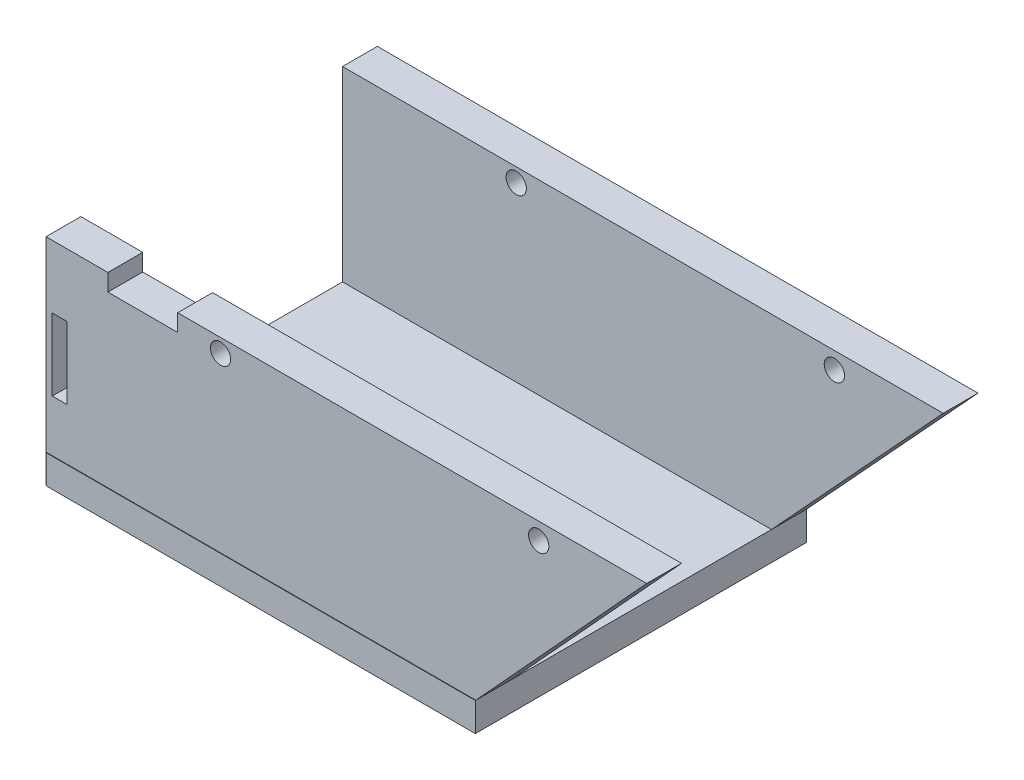
ISO-10303-21;
HEADER;
FILE_DESCRIPTION(('STEP AP214'),'2;1');
FILE_NAME('part.step','',(''),(''),'','','');
FILE_SCHEMA(('AUTOMOTIVE_DESIGN { 1 0 10303 214 1 1 1 1 }'));
ENDSEC;
DATA;
#1=APPLICATION_CONTEXT('core data for automotive mechanical design processes');
#2=APPLICATION_PROTOCOL_DEFINITION('international standard','automotive_design',2000,#1);
#3=PRODUCT_CONTEXT('',#1,'mechanical');
#4=PRODUCT('Part','Part','',(#3));
#5=PRODUCT_RELATED_PRODUCT_CATEGORY('part','',(#4));
#6=PRODUCT_DEFINITION_FORMATION('','',#4);
#7=PRODUCT_DEFINITION_CONTEXT('part definition',#1,'design');
#8=PRODUCT_DEFINITION('design','',#6,#7);
#9=PRODUCT_DEFINITION_SHAPE('','',#8);
#10=(LENGTH_UNIT() NAMED_UNIT(*) SI_UNIT(.MILLI.,.METRE.));
#11=(NAMED_UNIT(*) PLANE_ANGLE_UNIT() SI_UNIT($,.RADIAN.));
#12=(NAMED_UNIT(*) SI_UNIT($,.STERADIAN.) SOLID_ANGLE_UNIT());
#13=UNCERTAINTY_MEASURE_WITH_UNIT(LENGTH_MEASURE(1.E-05),#10,'distance_accuracy_value','');
#14=(GEOMETRIC_REPRESENTATION_CONTEXT(3) GLOBAL_UNCERTAINTY_ASSIGNED_CONTEXT((#13)) GLOBAL_UNIT_ASSIGNED_CONTEXT((#10,
#11,#12)) REPRESENTATION_CONTEXT('',''));
#15=CARTESIAN_POINT('',(0.,0.,0.));
#16=DIRECTION('',(0.,0.,1.));
#17=DIRECTION('',(1.,0.,0.));
#18=AXIS2_PLACEMENT_3D('',#15,#16,#17);
#19=CARTESIAN_POINT('',(0.,4.,0.));
#20=DIRECTION('',(0.,-1.,0.));
#21=DIRECTION('',(0.,0.,-1.));
#22=AXIS2_PLACEMENT_3D('',#19,#20,#21);
#23=PLANE('',#22);
#24=DIRECTION('',(1.,0.,0.));
#25=VECTOR('',#24,1.);
#26=CARTESIAN_POINT('',(0.,4.,0.));
#27=LINE('',#26,#25);
#28=CARTESIAN_POINT('',(0.,4.,0.));
#29=VERTEX_POINT('',#28);
#30=CARTESIAN_POINT('',(59.7906623879574,4.,0.));
#31=VERTEX_POINT('',#30);
#32=EDGE_CURVE('E294',#29,#31,#27,.T.);
#33=ORIENTED_EDGE('',*,*,#32,.T.);
#34=DIRECTION('',(0.,0.,-1.));
#35=VECTOR('',#34,1.);
#36=CARTESIAN_POINT('',(59.7906623879574,4.,0.861356651421077));
#37=LINE('',#36,#35);
#38=CARTESIAN_POINT('',(59.7906623879574,4.,-0.0663746460933395));
#39=VERTEX_POINT('',#38);
#40=EDGE_CURVE('E223',#31,#39,#37,.T.);
#41=ORIENTED_EDGE('',*,*,#40,.T.);
#42=DIRECTION('',(1.,0.,0.));
#43=VECTOR('',#42,1.);
#44=CARTESIAN_POINT('',(0.,4.,-0.0663746460933395));
#45=LINE('',#44,#43);
#46=CARTESIAN_POINT('',(0.,4.,-0.0663746460933395));
#47=VERTEX_POINT('',#46);
#48=EDGE_CURVE('E258',#47,#39,#45,.T.);
#49=ORIENTED_EDGE('',*,*,#48,.F.);
#50=DIRECTION('',(0.,0.,1.));
#51=VECTOR('',#50,1.);
#52=CARTESIAN_POINT('',(0.,4.,0.));
#53=LINE('',#52,#51);
#54=EDGE_CURVE('E295',#47,#29,#53,.T.);
#55=ORIENTED_EDGE('',*,*,#54,.T.);
#56=EDGE_LOOP('',(#33,#41,#49,#55));
#57=FACE_BOUND('',#56,.T.);
#58=ADVANCED_FACE('F39',(#57),#23,.F.);
#59=CARTESIAN_POINT('',(0.,30.,0.));
#60=DIRECTION('',(0.,1.,0.));
#61=DIRECTION('',(0.,0.,1.));
#62=AXIS2_PLACEMENT_3D('',#59,#60,#61);
#63=PLANE('',#62);
#64=DIRECTION('',(1.,0.,0.));
#65=VECTOR('',#64,1.);
#66=CARTESIAN_POINT('',(-0.121197212058664,30.,-0.0663746460933395));
#67=LINE('',#66,#65);
#68=CARTESIAN_POINT('',(-0.121197212058664,30.,-0.0663746460933395));
#69=VERTEX_POINT('',#68);
#70=CARTESIAN_POINT('',(8.50407502134942,30.,-0.0663746460933395));
#71=VERTEX_POINT('',#70);
#72=EDGE_CURVE('E494',#69,#71,#67,.T.);
#73=ORIENTED_EDGE('',*,*,#72,.T.);
#74=DIRECTION('',(0.,0.,-1.));
#75=VECTOR('',#74,1.);
#76=CARTESIAN_POINT('',(8.50407502134942,30.,0.));
#77=LINE('',#76,#75);
#78=CARTESIAN_POINT('',(8.50407502134942,30.,-4.92581520856804));
#79=VERTEX_POINT('',#78);
#80=EDGE_CURVE('E317',#71,#79,#77,.T.);
#81=ORIENTED_EDGE('',*,*,#80,.T.);
#82=DIRECTION('',(-1.,0.,0.));
#83=VECTOR('',#82,1.);
#84=CARTESIAN_POINT('',(-0.121197212058665,30.,-4.92581520856804));
#85=LINE('',#84,#83);
#86=CARTESIAN_POINT('',(-0.121197212058665,30.,-4.92581520856804));
#87=VERTEX_POINT('',#86);
#88=EDGE_CURVE('E502',#79,#87,#85,.T.);
#89=ORIENTED_EDGE('',*,*,#88,.T.);
#90=DIRECTION('',(0.,0.,1.));
#91=VECTOR('',#90,1.);
#92=CARTESIAN_POINT('',(-0.121197212058665,30.,-4.92581520856804));
#93=LINE('',#92,#91);
#94=EDGE_CURVE('E488',#87,#69,#93,.T.);
#95=ORIENTED_EDGE('',*,*,#94,.T.);
#96=EDGE_LOOP('',(#73,#81,#89,#95));
#97=FACE_BOUND('',#96,.T.);
#98=ADVANCED_FACE('F566',(#97),#63,.T.);
#99=CARTESIAN_POINT('',(0.,0.,0.));
#100=DIRECTION('',(0.,-1.,0.));
#101=DIRECTION('',(0.,0.,-1.));
#102=AXIS2_PLACEMENT_3D('',#99,#100,#101);
#103=PLANE('',#102);
#104=DIRECTION('',(0.,0.,-1.));
#105=VECTOR('',#104,1.);
#106=CARTESIAN_POINT('',(59.7906623879574,0.,0.861356651421077));
#107=LINE('',#106,#105);
#108=CARTESIAN_POINT('',(59.7906623879574,0.,0.));
#109=VERTEX_POINT('',#108);
#110=CARTESIAN_POINT('',(59.7906623879574,0.,-46.1386433485789));
#111=VERTEX_POINT('',#110);
#112=EDGE_CURVE('E246',#109,#111,#107,.T.);
#113=ORIENTED_EDGE('',*,*,#112,.F.);
#114=DIRECTION('',(1.,0.,0.));
#115=VECTOR('',#114,1.);
#116=CARTESIAN_POINT('',(0.,0.,0.));
#117=LINE('',#116,#115);
#118=CARTESIAN_POINT('',(0.,0.,0.));
#119=VERTEX_POINT('',#118);
#120=EDGE_CURVE('E303',#119,#109,#117,.T.);
#121=ORIENTED_EDGE('',*,*,#120,.F.);
#122=DIRECTION('',(0.,0.,1.));
#123=VECTOR('',#122,1.);
#124=CARTESIAN_POINT('',(0.,0.,0.));
#125=LINE('',#124,#123);
#126=CARTESIAN_POINT('',(0.,0.,-0.0663746460933395));
#127=VERTEX_POINT('',#126);
#128=EDGE_CURVE('E291',#127,#119,#125,.T.);
#129=ORIENTED_EDGE('',*,*,#128,.F.);
#130=DIRECTION('',(1.,0.,0.));
#131=VECTOR('',#130,1.);
#132=CARTESIAN_POINT('',(-0.121197212058664,0.,-0.0663746460933395));
#133=LINE('',#132,#131);
#134=CARTESIAN_POINT('',(-0.121197212058664,0.,-0.0663746460933395));
#135=VERTEX_POINT('',#134);
#136=EDGE_CURVE('E511',#135,#127,#133,.T.);
#137=ORIENTED_EDGE('',*,*,#136,.F.);
#138=DIRECTION('',(0.,0.,1.));
#139=VECTOR('',#138,1.);
#140=CARTESIAN_POINT('',(-0.121197212058665,0.,-4.92581520856804));
#141=LINE('',#140,#139);
#142=CARTESIAN_POINT('',(-0.121197212058665,0.,-4.92581520856804));
#143=VERTEX_POINT('',#142);
#144=EDGE_CURVE('E487',#143,#135,#141,.T.);
#145=ORIENTED_EDGE('',*,*,#144,.F.);
#146=DIRECTION('',(-1.,0.,0.));
#147=VECTOR('',#146,1.);
#148=CARTESIAN_POINT('',(-0.121197212058665,0.,-4.92581520856804));
#149=LINE('',#148,#147);
#150=CARTESIAN_POINT('',(0.,0.,-4.92581520856804));
#151=VERTEX_POINT('',#150);
#152=EDGE_CURVE('E493',#151,#143,#149,.T.);
#153=ORIENTED_EDGE('',*,*,#152,.F.);
#154=CARTESIAN_POINT('',(0.,0.,-46.1386433485789));
#155=VERTEX_POINT('',#154);
#156=EDGE_CURVE('E300',#155,#151,#125,.T.);
#157=ORIENTED_EDGE('',*,*,#156,.F.);
#158=DIRECTION('',(-1.,0.,0.));
#159=VECTOR('',#158,1.);
#160=CARTESIAN_POINT('',(0.,0.,-46.1386433485789));
#161=LINE('',#160,#159);
#162=EDGE_CURVE('E307',#111,#155,#161,.T.);
#163=ORIENTED_EDGE('',*,*,#162,.F.);
#164=EDGE_LOOP('',(#113,#121,#129,#137,#145,#153,#157,#163));
#165=FACE_BOUND('',#164,.T.);
#166=DIRECTION('',(0.,0.,-1.));
#167=VECTOR('',#166,1.);
#168=CARTESIAN_POINT('',(28.6391922760458,0.,-9.09575564875809));
#169=LINE('',#168,#167);
#170=CARTESIAN_POINT('',(28.6391922760458,0.,-9.09575564875809));
#171=VERTEX_POINT('',#170);
#172=CARTESIAN_POINT('',(28.6391922760458,0.,-19.493950499708));
#173=VERTEX_POINT('',#172);
#174=EDGE_CURVE('E434',#171,#173,#169,.T.);
#175=ORIENTED_EDGE('',*,*,#174,.T.);
#176=DIRECTION('',(-1.,0.,0.));
#177=VECTOR('',#176,1.);
#178=CARTESIAN_POINT('',(28.6391922760458,0.,-19.493950499708));
#179=LINE('',#178,#177);
#180=CARTESIAN_POINT('',(17.587706096208,0.,-19.493950499708));
#181=VERTEX_POINT('',#180);
#182=EDGE_CURVE('E429',#173,#181,#179,.T.);
#183=ORIENTED_EDGE('',*,*,#182,.T.);
#184=DIRECTION('',(0.,0.,-1.));
#185=VECTOR('',#184,1.);
#186=CARTESIAN_POINT('',(17.587706096208,0.,-9.09575564875809));
#187=LINE('',#186,#185);
#188=CARTESIAN_POINT('',(17.587706096208,0.,-9.09575564875809));
#189=VERTEX_POINT('',#188);
#190=EDGE_CURVE('E449',#189,#181,#187,.T.);
#191=ORIENTED_EDGE('',*,*,#190,.F.);
#192=DIRECTION('',(-1.,0.,0.));
#193=VECTOR('',#192,1.);
#194=CARTESIAN_POINT('',(28.6391922760458,0.,-9.09575564875809));
#195=LINE('',#194,#193);
#196=EDGE_CURVE('E453',#171,#189,#195,.T.);
#197=ORIENTED_EDGE('',*,*,#196,.F.);
#198=EDGE_LOOP('',(#175,#183,#191,#197));
#199=FACE_BOUND('',#198,.T.);
#200=ADVANCED_FACE('F532',(#165,#199),#103,.T.);
#201=DIRECTION('',(-1.,0.,0.));
#202=VECTOR('',#201,1.);
#203=CARTESIAN_POINT('',(0.,4.,-4.92581520856804));
#204=LINE('',#203,#202);
#205=CARTESIAN_POINT('',(59.7906623879574,4.,-4.92581520856804));
#206=VERTEX_POINT('',#205);
#207=CARTESIAN_POINT('',(0.,4.,-4.92581520856804));
#208=VERTEX_POINT('',#207);
#209=EDGE_CURVE('E231',#206,#208,#204,.T.);
#210=ORIENTED_EDGE('',*,*,#209,.F.);
#211=CARTESIAN_POINT('',(59.7906623879574,4.,-41.2792027861042));
#212=VERTEX_POINT('',#211);
#213=EDGE_CURVE('E224',#206,#212,#37,.T.);
#214=ORIENTED_EDGE('',*,*,#213,.T.);
#215=DIRECTION('',(1.,0.,0.));
#216=VECTOR('',#215,1.);
#217=CARTESIAN_POINT('',(0.,4.,-41.2792027861042));
#218=LINE('',#217,#216);
#219=CARTESIAN_POINT('',(0.,4.,-41.2792027861042));
#220=VERTEX_POINT('',#219);
#221=EDGE_CURVE('E287',#220,#212,#218,.T.);
#222=ORIENTED_EDGE('',*,*,#221,.F.);
#223=EDGE_CURVE('E250',#220,#208,#53,.T.);
#224=ORIENTED_EDGE('',*,*,#223,.T.);
#225=EDGE_LOOP('',(#210,#214,#222,#224));
#226=FACE_BOUND('',#225,.T.);
#227=ADVANCED_FACE('F248',(#226),#23,.F.);
#228=CARTESIAN_POINT('',(0.,4.,0.));
#229=DIRECTION('',(1.,0.,0.));
#230=DIRECTION('',(0.,0.,-1.));
#231=AXIS2_PLACEMENT_3D('',#228,#229,#230);
#232=PLANE('',#231);
#233=DIRECTION('',(0.,1.,0.));
#234=VECTOR('',#233,1.);
#235=CARTESIAN_POINT('',(0.,4.,-0.0663746460933395));
#236=LINE('',#235,#234);
#237=EDGE_CURVE('E252',#127,#47,#236,.T.);
#238=ORIENTED_EDGE('',*,*,#237,.F.);
#239=ORIENTED_EDGE('',*,*,#128,.T.);
#240=DIRECTION('',(0.,-1.,0.));
#241=VECTOR('',#240,1.);
#242=CARTESIAN_POINT('',(0.,4.,0.));
#243=LINE('',#242,#241);
#244=EDGE_CURVE('E313',#29,#119,#243,.T.);
#245=ORIENTED_EDGE('',*,*,#244,.F.);
#246=ORIENTED_EDGE('',*,*,#54,.F.);
#247=EDGE_LOOP('',(#238,#239,#245,#246));
#248=FACE_BOUND('',#247,.T.);
#249=ADVANCED_FACE('F41',(#248),#232,.F.);
#250=DIRECTION('',(0.,-1.,0.));
#251=VECTOR('',#250,1.);
#252=CARTESIAN_POINT('',(0.,4.,-4.92581520856804));
#253=LINE('',#252,#251);
#254=EDGE_CURVE('E253',#208,#151,#253,.T.);
#255=ORIENTED_EDGE('',*,*,#254,.F.);
#256=ORIENTED_EDGE('',*,*,#223,.F.);
#257=DIRECTION('',(0.,-1.,0.));
#258=VECTOR('',#257,1.);
#259=CARTESIAN_POINT('',(0.,30.,-41.2792027861042));
#260=LINE('',#259,#258);
#261=CARTESIAN_POINT('',(0.,30.,-41.2792027861042));
#262=VERTEX_POINT('',#261);
#263=EDGE_CURVE('E283',#262,#220,#260,.T.);
#264=ORIENTED_EDGE('',*,*,#263,.F.);
#265=DIRECTION('',(0.,0.,1.));
#266=VECTOR('',#265,1.);
#267=CARTESIAN_POINT('',(0.,30.,-46.1386433485789));
#268=LINE('',#267,#266);
#269=CARTESIAN_POINT('',(0.,30.,-46.1386433485789));
#270=VERTEX_POINT('',#269);
#271=EDGE_CURVE('E267',#270,#262,#268,.T.);
#272=ORIENTED_EDGE('',*,*,#271,.F.);
#273=DIRECTION('',(0.,-1.,0.));
#274=VECTOR('',#273,1.);
#275=CARTESIAN_POINT('',(0.,4.,-46.1386433485789));
#276=LINE('',#275,#274);
#277=EDGE_CURVE('E299',#270,#155,#276,.T.);
#278=ORIENTED_EDGE('',*,*,#277,.T.);
#279=ORIENTED_EDGE('',*,*,#156,.T.);
#280=EDGE_LOOP('',(#255,#256,#264,#272,#278,#279));
#281=FACE_BOUND('',#280,.T.);
#282=ADVANCED_FACE('F581',(#281),#232,.F.);
#283=CARTESIAN_POINT('',(0.,4.,0.));
#284=DIRECTION('',(0.,0.,-1.));
#285=DIRECTION('',(-1.,0.,0.));
#286=AXIS2_PLACEMENT_3D('',#283,#284,#285);
#287=PLANE('',#286);
#288=ORIENTED_EDGE('',*,*,#120,.T.);
#289=DIRECTION('',(0.,1.,0.));
#290=VECTOR('',#289,1.);
#291=CARTESIAN_POINT('',(59.7906623879574,4.,0.));
#292=LINE('',#291,#290);
#293=EDGE_CURVE('E377',#109,#31,#292,.T.);
#294=ORIENTED_EDGE('',*,*,#293,.T.);
#295=ORIENTED_EDGE('',*,*,#32,.F.);
#296=ORIENTED_EDGE('',*,*,#244,.T.);
#297=EDGE_LOOP('',(#288,#294,#295,#296));
#298=FACE_BOUND('',#297,.T.);
#299=ADVANCED_FACE('F588',(#298),#287,.F.);
#300=CARTESIAN_POINT('',(0.,4.,-46.1386433485789));
#301=DIRECTION('',(0.,0.,1.));
#302=DIRECTION('',(1.,0.,0.));
#303=AXIS2_PLACEMENT_3D('',#300,#301,#302);
#304=PLANE('',#303);
#305=CARTESIAN_POINT('',(68.5585511504954,27.6457680795579,-46.1386433485789));
#306=DIRECTION('',(0.,0.,1.));
#307=DIRECTION('',(1.,0.,0.));
#308=AXIS2_PLACEMENT_3D('',#305,#306,#307);
#309=CIRCLE('',#308,1.41452911502597);
#310=CARTESIAN_POINT('',(69.9730802655213,27.6457680795579,-46.1386433485789));
#311=VERTEX_POINT('',#310);
#312=EDGE_CURVE('E237',#311,#311,#309,.T.);
#313=ORIENTED_EDGE('',*,*,#312,.T.);
#314=EDGE_LOOP('',(#313));
#315=FACE_BOUND('',#314,.T.);
#316=CARTESIAN_POINT('',(24.2084878524862,28.0642925065622,-46.1386433485789));
#317=DIRECTION('',(0.,0.,1.));
#318=DIRECTION('',(1.,0.,0.));
#319=AXIS2_PLACEMENT_3D('',#316,#317,#318);
#320=CIRCLE('',#319,1.41452911502597);
#321=CARTESIAN_POINT('',(25.6230169675122,28.0642925065622,-46.1386433485789));
#322=VERTEX_POINT('',#321);
#323=EDGE_CURVE('E347',#322,#322,#320,.T.);
#324=ORIENTED_EDGE('',*,*,#323,.T.);
#325=EDGE_LOOP('',(#324));
#326=FACE_BOUND('',#325,.T.);
#327=DIRECTION('',(-0.677245321986034,-0.735757279167548,0.));
#328=VECTOR('',#327,1.);
#329=CARTESIAN_POINT('',(32.3670038646585,-25.7929800692494,-46.1386433485789));
#330=LINE('',#329,#328);
#331=CARTESIAN_POINT('',(83.7229820132004,30.,-46.1386433485789));
#332=VERTEX_POINT('',#331);
#333=CARTESIAN_POINT('',(59.7906623879574,4.,-46.1386433485789));
#334=VERTEX_POINT('',#333);
#335=EDGE_CURVE('E477',#332,#334,#330,.T.);
#336=ORIENTED_EDGE('',*,*,#335,.T.);
#337=DIRECTION('',(0.,1.,0.));
#338=VECTOR('',#337,1.);
#339=CARTESIAN_POINT('',(59.7906623879574,0.,-46.1386433485789));
#340=LINE('',#339,#338);
#341=EDGE_CURVE('E372',#111,#334,#340,.T.);
#342=ORIENTED_EDGE('',*,*,#341,.F.);
#343=ORIENTED_EDGE('',*,*,#162,.T.);
#344=ORIENTED_EDGE('',*,*,#277,.F.);
#345=DIRECTION('',(-1.,0.,0.));
#346=VECTOR('',#345,1.);
#347=CARTESIAN_POINT('',(0.,30.,-46.1386433485789));
#348=LINE('',#347,#346);
#349=EDGE_CURVE('E279',#332,#270,#348,.T.);
#350=ORIENTED_EDGE('',*,*,#349,.F.);
#351=EDGE_LOOP('',(#336,#342,#343,#344,#350));
#352=FACE_BOUND('',#351,.T.);
#353=ADVANCED_FACE('F585',(#315,#326,#352),#304,.F.);
#354=CARTESIAN_POINT('',(0.,30.,-41.2792027861042));
#355=DIRECTION('',(0.,0.,-1.));
#356=DIRECTION('',(-1.,0.,0.));
#357=AXIS2_PLACEMENT_3D('',#354,#355,#356);
#358=PLANE('',#357);
#359=CARTESIAN_POINT('',(68.5585511504954,27.6457680795579,-41.2792027861042));
#360=DIRECTION('',(0.,0.,-1.));
#361=DIRECTION('',(-1.,0.,0.));
#362=AXIS2_PLACEMENT_3D('',#359,#360,#361);
#363=CIRCLE('',#362,1.41452911502597);
#364=CARTESIAN_POINT('',(67.1440220354694,27.6457680795579,-41.2792027861042));
#365=VERTEX_POINT('',#364);
#366=EDGE_CURVE('E361',#365,#365,#363,.T.);
#367=ORIENTED_EDGE('',*,*,#366,.T.);
#368=EDGE_LOOP('',(#367));
#369=FACE_BOUND('',#368,.T.);
#370=CARTESIAN_POINT('',(24.2084878524862,28.0642925065622,-41.2792027861042));
#371=DIRECTION('',(0.,0.,-1.));
#372=DIRECTION('',(-1.,0.,0.));
#373=AXIS2_PLACEMENT_3D('',#370,#371,#372);
#374=CIRCLE('',#373,1.41452911502597);
#375=CARTESIAN_POINT('',(22.7939587374602,28.0642925065622,-41.2792027861042));
#376=VERTEX_POINT('',#375);
#377=EDGE_CURVE('E340',#376,#376,#374,.T.);
#378=ORIENTED_EDGE('',*,*,#377,.T.);
#379=EDGE_LOOP('',(#378));
#380=FACE_BOUND('',#379,.T.);
#381=ORIENTED_EDGE('',*,*,#221,.T.);
#382=DIRECTION('',(-0.677245321986034,-0.735757279167548,0.));
#383=VECTOR('',#382,1.);
#384=CARTESIAN_POINT('',(83.7229820132004,30.,-41.2792027861042));
#385=LINE('',#384,#383);
#386=CARTESIAN_POINT('',(83.7229820132004,30.,-41.2792027861042));
#387=VERTEX_POINT('',#386);
#388=EDGE_CURVE('E472',#387,#212,#385,.T.);
#389=ORIENTED_EDGE('',*,*,#388,.F.);
#390=DIRECTION('',(1.,0.,0.));
#391=VECTOR('',#390,1.);
#392=CARTESIAN_POINT('',(0.,30.,-41.2792027861042));
#393=LINE('',#392,#391);
#394=EDGE_CURVE('E271',#262,#387,#393,.T.);
#395=ORIENTED_EDGE('',*,*,#394,.F.);
#396=ORIENTED_EDGE('',*,*,#263,.T.);
#397=EDGE_LOOP('',(#381,#389,#395,#396));
#398=FACE_BOUND('',#397,.T.);
#399=ADVANCED_FACE('F587',(#369,#380,#398),#358,.F.);
#400=CARTESIAN_POINT('',(0.,30.,0.));
#401=DIRECTION('',(0.,1.,0.));
#402=DIRECTION('',(0.,0.,1.));
#403=AXIS2_PLACEMENT_3D('',#400,#401,#402);
#404=PLANE('',#403);
#405=ORIENTED_EDGE('',*,*,#271,.T.);
#406=ORIENTED_EDGE('',*,*,#394,.T.);
#407=DIRECTION('',(0.,0.,-1.));
#408=VECTOR('',#407,1.);
#409=CARTESIAN_POINT('',(83.7229820132004,30.,-46.1386433485789));
#410=LINE('',#409,#408);
#411=EDGE_CURVE('E275',#387,#332,#410,.T.);
#412=ORIENTED_EDGE('',*,*,#411,.T.);
#413=ORIENTED_EDGE('',*,*,#349,.T.);
#414=EDGE_LOOP('',(#405,#406,#412,#413));
#415=FACE_BOUND('',#414,.T.);
#416=ADVANCED_FACE('F603',(#415),#404,.T.);
#417=CARTESIAN_POINT('',(-0.121197212058664,30.,-0.0663746460933395));
#418=DIRECTION('',(0.,0.,-1.));
#419=DIRECTION('',(-1.,0.,0.));
#420=AXIS2_PLACEMENT_3D('',#417,#418,#419);
#421=PLANE('',#420);
#422=CARTESIAN_POINT('',(68.5585511504954,27.6457680795579,-0.0663746460933395));
#423=DIRECTION('',(0.,0.,1.));
#424=DIRECTION('',(1.,0.,0.));
#425=AXIS2_PLACEMENT_3D('',#422,#423,#424);
#426=CIRCLE('',#425,1.41452911502597);
#427=CARTESIAN_POINT('',(69.9730802655213,27.6457680795579,-0.0663746460933395));
#428=VERTEX_POINT('',#427);
#429=EDGE_CURVE('E341',#428,#428,#426,.T.);
#430=ORIENTED_EDGE('',*,*,#429,.F.);
#431=EDGE_LOOP('',(#430));
#432=FACE_BOUND('',#431,.T.);
#433=CARTESIAN_POINT('',(24.2084878524862,28.0642925065622,-0.0663746460933395));
#434=DIRECTION('',(0.,0.,1.));
#435=DIRECTION('',(1.,0.,0.));
#436=AXIS2_PLACEMENT_3D('',#433,#434,#435);
#437=CIRCLE('',#436,1.41452911502597);
#438=CARTESIAN_POINT('',(25.6230169675122,28.0642925065622,-0.0663746460933395));
#439=VERTEX_POINT('',#438);
#440=EDGE_CURVE('E350',#439,#439,#437,.T.);
#441=ORIENTED_EDGE('',*,*,#440,.F.);
#442=EDGE_LOOP('',(#441));
#443=FACE_BOUND('',#442,.T.);
#444=DIRECTION('',(-1.,0.,0.));
#445=VECTOR('',#444,1.);
#446=CARTESIAN_POINT('',(2.81627950396057,21.2324838019526,-0.0663746460933395));
#447=LINE('',#446,#445);
#448=CARTESIAN_POINT('',(2.81627950396057,21.2324838019526,-0.0663746460933395));
#449=VERTEX_POINT('',#448);
#450=CARTESIAN_POINT('',(0.747328793565316,21.2324838019526,-0.0663746460933395));
#451=VERTEX_POINT('',#450);
#452=EDGE_CURVE('E383',#449,#451,#447,.T.);
#453=ORIENTED_EDGE('',*,*,#452,.F.);
#454=DIRECTION('',(0.,1.,0.));
#455=VECTOR('',#454,1.);
#456=CARTESIAN_POINT('',(2.81627950396057,11.1989252465889,-0.0663746460933395));
#457=LINE('',#456,#455);
#458=CARTESIAN_POINT('',(2.81627950396057,11.1989252465889,-0.0663746460933395));
#459=VERTEX_POINT('',#458);
#460=EDGE_CURVE('E57',#459,#449,#457,.T.);
#461=ORIENTED_EDGE('',*,*,#460,.F.);
#462=DIRECTION('',(1.,0.,0.));
#463=VECTOR('',#462,1.);
#464=CARTESIAN_POINT('',(2.81627950396057,11.1989252465889,-0.0663746460933395));
#465=LINE('',#464,#463);
#466=CARTESIAN_POINT('',(0.747328793565316,11.1989252465889,-0.0663746460933395));
#467=VERTEX_POINT('',#466);
#468=EDGE_CURVE('E390',#467,#459,#465,.T.);
#469=ORIENTED_EDGE('',*,*,#468,.F.);
#470=DIRECTION('',(0.,-1.,0.));
#471=VECTOR('',#470,1.);
#472=CARTESIAN_POINT('',(0.747328793565316,11.1989252465889,-0.0663746460933395));
#473=LINE('',#472,#471);
#474=EDGE_CURVE('E386',#451,#467,#473,.T.);
#475=ORIENTED_EDGE('',*,*,#474,.F.);
#476=EDGE_LOOP('',(#453,#461,#469,#475));
#477=FACE_BOUND('',#476,.T.);
#478=ORIENTED_EDGE('',*,*,#48,.T.);
#479=DIRECTION('',(0.675474610907501,0.737383245008564,0.));
#480=VECTOR('',#479,1.);
#481=CARTESIAN_POINT('',(45.405096025758,-11.7040330371459,-0.0663746460933395));
#482=LINE('',#481,#480);
#483=CARTESIAN_POINT('',(83.4781501526332,29.8584946228411,-0.0663746460933395));
#484=VERTEX_POINT('',#483);
#485=EDGE_CURVE('E218',#39,#484,#482,.T.);
#486=ORIENTED_EDGE('',*,*,#485,.T.);
#487=DIRECTION('',(-0.657954189143697,-0.753057955929197,0.));
#488=VECTOR('',#487,1.);
#489=CARTESIAN_POINT('',(60.8853274779761,4.,-0.0663746460933395));
#490=LINE('',#489,#488);
#491=CARTESIAN_POINT('',(83.601784801142,30.,-0.0663746460933395));
#492=VERTEX_POINT('',#491);
#493=EDGE_CURVE('E481',#492,#484,#490,.T.);
#494=ORIENTED_EDGE('',*,*,#493,.F.);
#495=CARTESIAN_POINT('',(18.2355792677811,30.,-0.0663746460933395));
#496=VERTEX_POINT('',#495);
#497=EDGE_CURVE('E492',#496,#492,#67,.T.);
#498=ORIENTED_EDGE('',*,*,#497,.F.);
#499=DIRECTION('',(0.,1.,0.));
#500=VECTOR('',#499,1.);
#501=CARTESIAN_POINT('',(18.2355792677811,27.6228751395848,-0.0663746460933395));
#502=LINE('',#501,#500);
#503=CARTESIAN_POINT('',(18.2355792677811,27.6228751395848,-0.0663746460933395));
#504=VERTEX_POINT('',#503);
#505=EDGE_CURVE('E413',#504,#496,#502,.T.);
#506=ORIENTED_EDGE('',*,*,#505,.F.);
#507=DIRECTION('',(-1.,0.,0.));
#508=VECTOR('',#507,1.);
#509=CARTESIAN_POINT('',(18.2355792677811,27.6228751395848,-0.0663746460933395));
#510=LINE('',#509,#508);
#511=CARTESIAN_POINT('',(8.50407502134942,27.6228751395848,-0.0663746460933395));
#512=VERTEX_POINT('',#511);
#513=EDGE_CURVE('E409',#504,#512,#510,.T.);
#514=ORIENTED_EDGE('',*,*,#513,.T.);
#515=DIRECTION('',(0.,1.,0.));
#516=VECTOR('',#515,1.);
#517=CARTESIAN_POINT('',(8.50407502134942,27.6228751395848,-0.0663746460933395));
#518=LINE('',#517,#516);
#519=EDGE_CURVE('E398',#512,#71,#518,.T.);
#520=ORIENTED_EDGE('',*,*,#519,.T.);
#521=ORIENTED_EDGE('',*,*,#72,.F.);
#522=DIRECTION('',(0.,-1.,0.));
#523=VECTOR('',#522,1.);
#524=CARTESIAN_POINT('',(-0.121197212058664,30.,-0.0663746460933395));
#525=LINE('',#524,#523);
#526=EDGE_CURVE('E260',#69,#135,#525,.T.);
#527=ORIENTED_EDGE('',*,*,#526,.T.);
#528=ORIENTED_EDGE('',*,*,#136,.T.);
#529=ORIENTED_EDGE('',*,*,#237,.T.);
#530=EDGE_LOOP('',(#478,#486,#494,#498,#506,#514,#520,#521,#527,#528,#529));
#531=FACE_BOUND('',#530,.T.);
#532=ADVANCED_FACE('F523',(#432,#443,#477,#531),#421,.F.);
#533=CARTESIAN_POINT('',(-0.121197212058665,30.,-4.92581520856804));
#534=DIRECTION('',(0.,0.,1.));
#535=DIRECTION('',(1.,0.,0.));
#536=AXIS2_PLACEMENT_3D('',#533,#534,#535);
#537=PLANE('',#536);
#538=CARTESIAN_POINT('',(68.5585511504954,27.6457680795579,-4.92581520856804));
#539=DIRECTION('',(0.,0.,1.));
#540=DIRECTION('',(1.,0.,0.));
#541=AXIS2_PLACEMENT_3D('',#538,#539,#540);
#542=CIRCLE('',#541,1.41452911502597);
#543=CARTESIAN_POINT('',(69.9730802655213,27.6457680795579,-4.92581520856804));
#544=VERTEX_POINT('',#543);
#545=EDGE_CURVE('E43',#544,#544,#542,.T.);
#546=ORIENTED_EDGE('',*,*,#545,.T.);
#547=EDGE_LOOP('',(#546));
#548=FACE_BOUND('',#547,.T.);
#549=CARTESIAN_POINT('',(24.2084878524862,28.0642925065622,-4.92581520856804));
#550=DIRECTION('',(0.,0.,1.));
#551=DIRECTION('',(1.,0.,0.));
#552=AXIS2_PLACEMENT_3D('',#549,#550,#551);
#553=CIRCLE('',#552,1.41452911502597);
#554=CARTESIAN_POINT('',(25.6230169675122,28.0642925065622,-4.92581520856804));
#555=VERTEX_POINT('',#554);
#556=EDGE_CURVE('E337',#555,#555,#553,.T.);
#557=ORIENTED_EDGE('',*,*,#556,.T.);
#558=EDGE_LOOP('',(#557));
#559=FACE_BOUND('',#558,.T.);
#560=DIRECTION('',(1.,0.,0.));
#561=VECTOR('',#560,1.);
#562=CARTESIAN_POINT('',(-0.121197212058665,11.1989252465889,-4.92581520856804));
#563=LINE('',#562,#561);
#564=CARTESIAN_POINT('',(0.747328793565316,11.1989252465889,-4.92581520856804));
#565=VERTEX_POINT('',#564);
#566=CARTESIAN_POINT('',(2.81627950396057,11.1989252465889,-4.92581520856804));
#567=VERTEX_POINT('',#566);
#568=EDGE_CURVE('E49',#565,#567,#563,.T.);
#569=ORIENTED_EDGE('',*,*,#568,.T.);
#570=DIRECTION('',(0.,1.,0.));
#571=VECTOR('',#570,1.);
#572=CARTESIAN_POINT('',(2.81627950396057,30.,-4.92581520856804));
#573=LINE('',#572,#571);
#574=CARTESIAN_POINT('',(2.81627950396057,21.2324838019526,-4.92581520856804));
#575=VERTEX_POINT('',#574);
#576=EDGE_CURVE('E11',#567,#575,#573,.T.);
#577=ORIENTED_EDGE('',*,*,#576,.T.);
#578=DIRECTION('',(-1.,0.,0.));
#579=VECTOR('',#578,1.);
#580=CARTESIAN_POINT('',(-0.121197212058665,21.2324838019526,-4.92581520856804));
#581=LINE('',#580,#579);
#582=CARTESIAN_POINT('',(0.747328793565316,21.2324838019526,-4.92581520856804));
#583=VERTEX_POINT('',#582);
#584=EDGE_CURVE('E327',#575,#583,#581,.T.);
#585=ORIENTED_EDGE('',*,*,#584,.T.);
#586=DIRECTION('',(0.,-1.,0.));
#587=VECTOR('',#586,1.);
#588=CARTESIAN_POINT('',(0.747328793565316,30.,-4.92581520856804));
#589=LINE('',#588,#587);
#590=EDGE_CURVE('E331',#583,#565,#589,.T.);
#591=ORIENTED_EDGE('',*,*,#590,.T.);
#592=EDGE_LOOP('',(#569,#577,#585,#591));
#593=FACE_BOUND('',#592,.T.);
#594=DIRECTION('',(-0.657954189143697,-0.753057955929197,0.));
#595=VECTOR('',#594,1.);
#596=CARTESIAN_POINT('',(47.3577948557664,-11.4828652713722,-4.92581520856804));
#597=LINE('',#596,#595);
#598=CARTESIAN_POINT('',(83.601784801142,30.,-4.92581520856804));
#599=VERTEX_POINT('',#598);
#600=CARTESIAN_POINT('',(83.4781501526332,29.8584946228411,-4.92581520856804));
#601=VERTEX_POINT('',#600);
#602=EDGE_CURVE('E234',#599,#601,#597,.T.);
#603=ORIENTED_EDGE('',*,*,#602,.T.);
#604=DIRECTION('',(0.675474610907501,0.737383245008564,0.));
#605=VECTOR('',#604,1.);
#606=CARTESIAN_POINT('',(59.7906623879574,4.,-4.92581520856804));
#607=LINE('',#606,#605);
#608=EDGE_CURVE('E215',#206,#601,#607,.T.);
#609=ORIENTED_EDGE('',*,*,#608,.F.);
#610=ORIENTED_EDGE('',*,*,#209,.T.);
#611=ORIENTED_EDGE('',*,*,#254,.T.);
#612=ORIENTED_EDGE('',*,*,#152,.T.);
#613=DIRECTION('',(0.,-1.,0.));
#614=VECTOR('',#613,1.);
#615=CARTESIAN_POINT('',(-0.121197212058665,30.,-4.92581520856804));
#616=LINE('',#615,#614);
#617=EDGE_CURVE('E507',#87,#143,#616,.T.);
#618=ORIENTED_EDGE('',*,*,#617,.F.);
#619=ORIENTED_EDGE('',*,*,#88,.F.);
#620=DIRECTION('',(0.,1.,0.));
#621=VECTOR('',#620,1.);
#622=CARTESIAN_POINT('',(8.50407502134942,30.,-4.92581520856804));
#623=LINE('',#622,#621);
#624=CARTESIAN_POINT('',(8.50407502134942,27.6228751395848,-4.92581520856804));
#625=VERTEX_POINT('',#624);
#626=EDGE_CURVE('E420',#625,#79,#623,.T.);
#627=ORIENTED_EDGE('',*,*,#626,.F.);
#628=DIRECTION('',(-1.,0.,0.));
#629=VECTOR('',#628,1.);
#630=CARTESIAN_POINT('',(-0.121197212058665,27.6228751395848,-4.92581520856804));
#631=LINE('',#630,#629);
#632=CARTESIAN_POINT('',(18.2355792677811,27.6228751395848,-4.92581520856804));
#633=VERTEX_POINT('',#632);
#634=EDGE_CURVE('E324',#633,#625,#631,.T.);
#635=ORIENTED_EDGE('',*,*,#634,.F.);
#636=DIRECTION('',(0.,1.,0.));
#637=VECTOR('',#636,1.);
#638=CARTESIAN_POINT('',(18.2355792677811,30.,-4.92581520856804));
#639=LINE('',#638,#637);
#640=CARTESIAN_POINT('',(18.2355792677811,30.,-4.92581520856804));
#641=VERTEX_POINT('',#640);
#642=EDGE_CURVE('E425',#633,#641,#639,.T.);
#643=ORIENTED_EDGE('',*,*,#642,.T.);
#644=EDGE_CURVE('E503',#599,#641,#85,.T.);
#645=ORIENTED_EDGE('',*,*,#644,.F.);
#646=EDGE_LOOP('',(#603,#609,#610,#611,#612,#618,#619,#627,#635,#643,#645));
#647=FACE_BOUND('',#646,.T.);
#648=ADVANCED_FACE('F228',(#548,#559,#593,#647),#537,.F.);
#649=CARTESIAN_POINT('',(-0.121197212058665,30.,-4.92581520856804));
#650=DIRECTION('',(1.,0.,0.));
#651=DIRECTION('',(0.,0.,-1.));
#652=AXIS2_PLACEMENT_3D('',#649,#650,#651);
#653=PLANE('',#652);
#654=ORIENTED_EDGE('',*,*,#144,.T.);
#655=ORIENTED_EDGE('',*,*,#526,.F.);
#656=ORIENTED_EDGE('',*,*,#94,.F.);
#657=ORIENTED_EDGE('',*,*,#617,.T.);
#658=EDGE_LOOP('',(#654,#655,#656,#657));
#659=FACE_BOUND('',#658,.T.);
#660=ADVANCED_FACE('F527',(#659),#653,.F.);
#661=DIRECTION('',(0.,0.,-1.));
#662=VECTOR('',#661,1.);
#663=CARTESIAN_POINT('',(18.2355792677811,30.,0.));
#664=LINE('',#663,#662);
#665=EDGE_CURVE('E321',#496,#641,#664,.T.);
#666=ORIENTED_EDGE('',*,*,#665,.F.);
#667=ORIENTED_EDGE('',*,*,#497,.T.);
#668=DIRECTION('',(0.,0.,-1.));
#669=VECTOR('',#668,1.);
#670=CARTESIAN_POINT('',(83.601784801142,30.,-4.92581520856804));
#671=LINE('',#670,#669);
#672=EDGE_CURVE('E498',#492,#599,#671,.T.);
#673=ORIENTED_EDGE('',*,*,#672,.T.);
#674=ORIENTED_EDGE('',*,*,#644,.T.);
#675=EDGE_LOOP('',(#666,#667,#673,#674));
#676=FACE_BOUND('',#675,.T.);
#677=ADVANCED_FACE('F573',(#676),#63,.T.);
#678=CARTESIAN_POINT('',(60.8853274779761,4.,-18.0663746460933));
#679=DIRECTION('',(-0.753057955929197,0.657954189143697,0.));
#680=DIRECTION('',(-0.657954189143697,-0.753057955929197,0.));
#681=AXIS2_PLACEMENT_3D('',#678,#679,#680);
#682=PLANE('',#681);
#683=ORIENTED_EDGE('',*,*,#493,.T.);
#684=DIRECTION('',(0.,0.,-1.));
#685=VECTOR('',#684,1.);
#686=CARTESIAN_POINT('',(83.4781501526332,29.8584946228411,42.074184791432));
#687=LINE('',#686,#685);
#688=EDGE_CURVE('E236',#484,#601,#687,.T.);
#689=ORIENTED_EDGE('',*,*,#688,.T.);
#690=ORIENTED_EDGE('',*,*,#602,.F.);
#691=ORIENTED_EDGE('',*,*,#672,.F.);
#692=EDGE_LOOP('',(#683,#689,#690,#691));
#693=FACE_BOUND('',#692,.T.);
#694=ADVANCED_FACE('F618',(#693),#682,.F.);
#695=CARTESIAN_POINT('',(83.7229820132004,30.,-59.2792027861042));
#696=DIRECTION('',(-0.735757279167548,0.677245321986034,0.));
#697=DIRECTION('',(-0.677245321986034,-0.735757279167548,0.));
#698=AXIS2_PLACEMENT_3D('',#695,#696,#697);
#699=PLANE('',#698);
#700=ORIENTED_EDGE('',*,*,#411,.F.);
#701=ORIENTED_EDGE('',*,*,#388,.T.);
#702=DIRECTION('',(0.,0.,1.));
#703=VECTOR('',#702,1.);
#704=CARTESIAN_POINT('',(59.7906623879574,4.,-59.2792027861042));
#705=LINE('',#704,#703);
#706=EDGE_CURVE('E242',#334,#212,#705,.T.);
#707=ORIENTED_EDGE('',*,*,#706,.F.);
#708=ORIENTED_EDGE('',*,*,#335,.F.);
#709=EDGE_LOOP('',(#700,#701,#707,#708));
#710=FACE_BOUND('',#709,.T.);
#711=ADVANCED_FACE('F605',(#710),#699,.F.);
#712=CARTESIAN_POINT('',(28.6391922760458,1.99999999999999,-19.493950499708));
#713=DIRECTION('',(0.,0.,1.));
#714=DIRECTION('',(1.,0.,0.));
#715=AXIS2_PLACEMENT_3D('',#712,#713,#714);
#716=PLANE('',#715);
#717=ORIENTED_EDGE('',*,*,#182,.F.);
#718=DIRECTION('',(0.,-1.,0.));
#719=VECTOR('',#718,1.);
#720=CARTESIAN_POINT('',(28.6391922760458,1.99999999999999,-19.493950499708));
#721=LINE('',#720,#719);
#722=CARTESIAN_POINT('',(28.6391922760458,1.99999999999999,-19.493950499708));
#723=VERTEX_POINT('',#722);
#724=EDGE_CURVE('E445',#723,#173,#721,.T.);
#725=ORIENTED_EDGE('',*,*,#724,.F.);
#726=DIRECTION('',(-1.,0.,0.));
#727=VECTOR('',#726,1.);
#728=CARTESIAN_POINT('',(28.6391922760458,1.99999999999999,-19.493950499708));
#729=LINE('',#728,#727);
#730=CARTESIAN_POINT('',(17.587706096208,1.99999999999999,-19.493950499708));
#731=VERTEX_POINT('',#730);
#732=EDGE_CURVE('E430',#723,#731,#729,.T.);
#733=ORIENTED_EDGE('',*,*,#732,.T.);
#734=DIRECTION('',(0.,-1.,0.));
#735=VECTOR('',#734,1.);
#736=CARTESIAN_POINT('',(17.587706096208,1.99999999999999,-19.493950499708));
#737=LINE('',#736,#735);
#738=EDGE_CURVE('E469',#731,#181,#737,.T.);
#739=ORIENTED_EDGE('',*,*,#738,.T.);
#740=EDGE_LOOP('',(#717,#725,#733,#739));
#741=FACE_BOUND('',#740,.T.);
#742=ADVANCED_FACE('F625',(#741),#716,.T.);
#743=CARTESIAN_POINT('',(17.587706096208,1.99999999999999,-9.09575564875809));
#744=DIRECTION('',(-1.,0.,0.));
#745=DIRECTION('',(0.,0.,1.));
#746=AXIS2_PLACEMENT_3D('',#743,#744,#745);
#747=PLANE('',#746);
#748=ORIENTED_EDGE('',*,*,#190,.T.);
#749=ORIENTED_EDGE('',*,*,#738,.F.);
#750=DIRECTION('',(0.,0.,-1.));
#751=VECTOR('',#750,1.);
#752=CARTESIAN_POINT('',(17.587706096208,1.99999999999999,-9.09575564875809));
#753=LINE('',#752,#751);
#754=CARTESIAN_POINT('',(17.587706096208,1.99999999999999,-9.09575564875809));
#755=VERTEX_POINT('',#754);
#756=EDGE_CURVE('E433',#755,#731,#753,.T.);
#757=ORIENTED_EDGE('',*,*,#756,.F.);
#758=DIRECTION('',(0.,-1.,0.));
#759=VECTOR('',#758,1.);
#760=CARTESIAN_POINT('',(17.587706096208,1.99999999999999,-9.09575564875809));
#761=LINE('',#760,#759);
#762=EDGE_CURVE('E466',#755,#189,#761,.T.);
#763=ORIENTED_EDGE('',*,*,#762,.T.);
#764=EDGE_LOOP('',(#748,#749,#757,#763));
#765=FACE_BOUND('',#764,.T.);
#766=ADVANCED_FACE('F870',(#765),#747,.F.);
#767=CARTESIAN_POINT('',(28.6391922760458,1.99999999999999,-9.09575564875809));
#768=DIRECTION('',(0.,0.,1.));
#769=DIRECTION('',(1.,0.,0.));
#770=AXIS2_PLACEMENT_3D('',#767,#768,#769);
#771=PLANE('',#770);
#772=ORIENTED_EDGE('',*,*,#196,.T.);
#773=ORIENTED_EDGE('',*,*,#762,.F.);
#774=DIRECTION('',(-1.,0.,0.));
#775=VECTOR('',#774,1.);
#776=CARTESIAN_POINT('',(28.6391922760458,1.99999999999999,-9.09575564875809));
#777=LINE('',#776,#775);
#778=CARTESIAN_POINT('',(28.6391922760458,1.99999999999999,-9.09575564875809));
#779=VERTEX_POINT('',#778);
#780=EDGE_CURVE('E438',#779,#755,#777,.T.);
#781=ORIENTED_EDGE('',*,*,#780,.F.);
#782=DIRECTION('',(0.,-1.,0.));
#783=VECTOR('',#782,1.);
#784=CARTESIAN_POINT('',(28.6391922760458,1.99999999999999,-9.09575564875809));
#785=LINE('',#784,#783);
#786=EDGE_CURVE('E463',#779,#171,#785,.T.);
#787=ORIENTED_EDGE('',*,*,#786,.T.);
#788=EDGE_LOOP('',(#772,#773,#781,#787));
#789=FACE_BOUND('',#788,.T.);
#790=ADVANCED_FACE('F866',(#789),#771,.F.);
#791=CARTESIAN_POINT('',(28.6391922760458,1.99999999999999,-9.09575564875809));
#792=DIRECTION('',(-1.,0.,0.));
#793=DIRECTION('',(0.,0.,1.));
#794=AXIS2_PLACEMENT_3D('',#791,#792,#793);
#795=PLANE('',#794);
#796=ORIENTED_EDGE('',*,*,#174,.F.);
#797=ORIENTED_EDGE('',*,*,#786,.F.);
#798=DIRECTION('',(0.,0.,-1.));
#799=VECTOR('',#798,1.);
#800=CARTESIAN_POINT('',(28.6391922760458,1.99999999999999,-9.09575564875809));
#801=LINE('',#800,#799);
#802=EDGE_CURVE('E442',#779,#723,#801,.T.);
#803=ORIENTED_EDGE('',*,*,#802,.T.);
#804=ORIENTED_EDGE('',*,*,#724,.T.);
#805=EDGE_LOOP('',(#796,#797,#803,#804));
#806=FACE_BOUND('',#805,.T.);
#807=ADVANCED_FACE('F862',(#806),#795,.T.);
#808=CARTESIAN_POINT('',(0.,1.99999999999999,0.));
#809=DIRECTION('',(0.,-1.,0.));
#810=DIRECTION('',(0.,0.,-1.));
#811=AXIS2_PLACEMENT_3D('',#808,#809,#810);
#812=PLANE('',#811);
#813=ORIENTED_EDGE('',*,*,#732,.F.);
#814=ORIENTED_EDGE('',*,*,#802,.F.);
#815=ORIENTED_EDGE('',*,*,#780,.T.);
#816=ORIENTED_EDGE('',*,*,#756,.T.);
#817=EDGE_LOOP('',(#813,#814,#815,#816));
#818=FACE_BOUND('',#817,.T.);
#819=ADVANCED_FACE('F690',(#818),#812,.T.);
#820=CARTESIAN_POINT('',(18.2355792677811,27.6228751395848,-8.06637464609333));
#821=DIRECTION('',(0.,1.,0.));
#822=DIRECTION('',(0.,0.,1.));
#823=AXIS2_PLACEMENT_3D('',#820,#821,#822);
#824=PLANE('',#823);
#825=ORIENTED_EDGE('',*,*,#634,.T.);
#826=DIRECTION('',(0.,0.,1.));
#827=VECTOR('',#826,1.);
#828=CARTESIAN_POINT('',(8.50407502134942,27.6228751395848,-8.06637464609333));
#829=LINE('',#828,#827);
#830=EDGE_CURVE('E416',#625,#512,#829,.T.);
#831=ORIENTED_EDGE('',*,*,#830,.T.);
#832=ORIENTED_EDGE('',*,*,#513,.F.);
#833=DIRECTION('',(0.,0.,1.));
#834=VECTOR('',#833,1.);
#835=CARTESIAN_POINT('',(18.2355792677811,27.6228751395848,-8.06637464609333));
#836=LINE('',#835,#834);
#837=EDGE_CURVE('E417',#633,#504,#836,.T.);
#838=ORIENTED_EDGE('',*,*,#837,.F.);
#839=EDGE_LOOP('',(#825,#831,#832,#838));
#840=FACE_BOUND('',#839,.T.);
#841=ADVANCED_FACE('F684',(#840),#824,.T.);
#842=CARTESIAN_POINT('',(18.2355792677811,27.6228751395848,-8.06637464609333));
#843=DIRECTION('',(1.,0.,0.));
#844=DIRECTION('',(0.,0.,-1.));
#845=AXIS2_PLACEMENT_3D('',#842,#843,#844);
#846=PLANE('',#845);
#847=ORIENTED_EDGE('',*,*,#837,.T.);
#848=ORIENTED_EDGE('',*,*,#505,.T.);
#849=ORIENTED_EDGE('',*,*,#665,.T.);
#850=ORIENTED_EDGE('',*,*,#642,.F.);
#851=EDGE_LOOP('',(#847,#848,#849,#850));
#852=FACE_BOUND('',#851,.T.);
#853=ADVANCED_FACE('F689',(#852),#846,.F.);
#854=CARTESIAN_POINT('',(8.50407502134942,27.6228751395848,-8.06637464609333));
#855=DIRECTION('',(1.,0.,0.));
#856=DIRECTION('',(0.,0.,-1.));
#857=AXIS2_PLACEMENT_3D('',#854,#855,#856);
#858=PLANE('',#857);
#859=ORIENTED_EDGE('',*,*,#626,.T.);
#860=ORIENTED_EDGE('',*,*,#80,.F.);
#861=ORIENTED_EDGE('',*,*,#519,.F.);
#862=ORIENTED_EDGE('',*,*,#830,.F.);
#863=EDGE_LOOP('',(#859,#860,#861,#862));
#864=FACE_BOUND('',#863,.T.);
#865=ADVANCED_FACE('F701',(#864),#858,.T.);
#866=CARTESIAN_POINT('',(2.81627950396057,11.1989252465889,-8.06637464609333));
#867=DIRECTION('',(1.,0.,0.));
#868=DIRECTION('',(0.,0.,-1.));
#869=AXIS2_PLACEMENT_3D('',#866,#867,#868);
#870=PLANE('',#869);
#871=DIRECTION('',(0.,0.,1.));
#872=VECTOR('',#871,1.);
#873=CARTESIAN_POINT('',(2.81627950396057,11.1989252465889,-8.06637464609333));
#874=LINE('',#873,#872);
#875=EDGE_CURVE('E395',#567,#459,#874,.T.);
#876=ORIENTED_EDGE('',*,*,#875,.T.);
#877=ORIENTED_EDGE('',*,*,#460,.T.);
#878=DIRECTION('',(0.,0.,1.));
#879=VECTOR('',#878,1.);
#880=CARTESIAN_POINT('',(2.81627950396057,21.2324838019526,-8.06637464609333));
#881=LINE('',#880,#879);
#882=EDGE_CURVE('E394',#575,#449,#881,.T.);
#883=ORIENTED_EDGE('',*,*,#882,.F.);
#884=ORIENTED_EDGE('',*,*,#576,.F.);
#885=EDGE_LOOP('',(#876,#877,#883,#884));
#886=FACE_BOUND('',#885,.T.);
#887=ADVANCED_FACE('F711',(#886),#870,.F.);
#888=CARTESIAN_POINT('',(2.81627950396057,11.1989252465889,-8.06637464609333));
#889=DIRECTION('',(0.,-1.,0.));
#890=DIRECTION('',(0.,0.,-1.));
#891=AXIS2_PLACEMENT_3D('',#888,#889,#890);
#892=PLANE('',#891);
#893=DIRECTION('',(0.,0.,1.));
#894=VECTOR('',#893,1.);
#895=CARTESIAN_POINT('',(0.747328793565316,11.1989252465889,-8.06637464609333));
#896=LINE('',#895,#894);
#897=EDGE_CURVE('E399',#565,#467,#896,.T.);
#898=ORIENTED_EDGE('',*,*,#897,.T.);
#899=ORIENTED_EDGE('',*,*,#468,.T.);
#900=ORIENTED_EDGE('',*,*,#875,.F.);
#901=ORIENTED_EDGE('',*,*,#568,.F.);
#902=EDGE_LOOP('',(#898,#899,#900,#901));
#903=FACE_BOUND('',#902,.T.);
#904=ADVANCED_FACE('F721',(#903),#892,.F.);
#905=CARTESIAN_POINT('',(0.747328793565316,11.1989252465889,-8.06637464609333));
#906=DIRECTION('',(-1.,0.,0.));
#907=DIRECTION('',(0.,0.,1.));
#908=AXIS2_PLACEMENT_3D('',#905,#906,#907);
#909=PLANE('',#908);
#910=DIRECTION('',(0.,0.,1.));
#911=VECTOR('',#910,1.);
#912=CARTESIAN_POINT('',(0.747328793565316,21.2324838019526,-8.06637464609333));
#913=LINE('',#912,#911);
#914=EDGE_CURVE('E65',#583,#451,#913,.T.);
#915=ORIENTED_EDGE('',*,*,#914,.T.);
#916=ORIENTED_EDGE('',*,*,#474,.T.);
#917=ORIENTED_EDGE('',*,*,#897,.F.);
#918=ORIENTED_EDGE('',*,*,#590,.F.);
#919=EDGE_LOOP('',(#915,#916,#917,#918));
#920=FACE_BOUND('',#919,.T.);
#921=ADVANCED_FACE('F730',(#920),#909,.F.);
#922=CARTESIAN_POINT('',(2.81627950396057,21.2324838019526,-8.06637464609333));
#923=DIRECTION('',(0.,1.,0.));
#924=DIRECTION('',(0.,0.,1.));
#925=AXIS2_PLACEMENT_3D('',#922,#923,#924);
#926=PLANE('',#925);
#927=ORIENTED_EDGE('',*,*,#882,.T.);
#928=ORIENTED_EDGE('',*,*,#452,.T.);
#929=ORIENTED_EDGE('',*,*,#914,.F.);
#930=ORIENTED_EDGE('',*,*,#584,.F.);
#931=EDGE_LOOP('',(#927,#928,#929,#930));
#932=FACE_BOUND('',#931,.T.);
#933=ADVANCED_FACE('F740',(#932),#926,.F.);
#934=CARTESIAN_POINT('',(59.7906623879574,0.,0.861356651421077));
#935=DIRECTION('',(-1.,0.,0.));
#936=DIRECTION('',(0.,0.,1.));
#937=AXIS2_PLACEMENT_3D('',#934,#935,#936);
#938=PLANE('',#937);
#939=ORIENTED_EDGE('',*,*,#112,.T.);
#940=ORIENTED_EDGE('',*,*,#341,.T.);
#941=ORIENTED_EDGE('',*,*,#706,.T.);
#942=ORIENTED_EDGE('',*,*,#213,.F.);
#943=EDGE_CURVE('E212',#39,#206,#37,.T.);
#944=ORIENTED_EDGE('',*,*,#943,.F.);
#945=ORIENTED_EDGE('',*,*,#40,.F.);
#946=ORIENTED_EDGE('',*,*,#293,.F.);
#947=EDGE_LOOP('',(#939,#940,#941,#942,#944,#945,#946));
#948=FACE_BOUND('',#947,.T.);
#949=ADVANCED_FACE('F240',(#948),#938,.F.);
#950=CARTESIAN_POINT('',(59.7906623879574,4.,42.074184791432));
#951=DIRECTION('',(-0.737383245008564,0.675474610907501,0.));
#952=DIRECTION('',(-0.675474610907501,-0.737383245008564,0.));
#953=AXIS2_PLACEMENT_3D('',#950,#951,#952);
#954=PLANE('',#953);
#955=ORIENTED_EDGE('',*,*,#943,.T.);
#956=ORIENTED_EDGE('',*,*,#608,.T.);
#957=ORIENTED_EDGE('',*,*,#688,.F.);
#958=ORIENTED_EDGE('',*,*,#485,.F.);
#959=EDGE_LOOP('',(#955,#956,#957,#958));
#960=FACE_BOUND('',#959,.T.);
#961=ADVANCED_FACE('F214',(#960),#954,.F.);
#962=CARTESIAN_POINT('',(24.2084878524862,28.0642925065622,-58.0663746460934));
#963=DIRECTION('',(0.,0.,1.));
#964=DIRECTION('',(1.,0.,0.));
#965=AXIS2_PLACEMENT_3D('',#962,#963,#964);
#966=CYLINDRICAL_SURFACE('',#965,1.41452911502597);
#967=ORIENTED_EDGE('',*,*,#440,.T.);
#968=EDGE_LOOP('',(#967));
#969=FACE_BOUND('',#968,.T.);
#970=ORIENTED_EDGE('',*,*,#556,.F.);
#971=EDGE_LOOP('',(#970));
#972=FACE_BOUND('',#971,.T.);
#973=ADVANCED_FACE('F553',(#969,#972),#966,.F.);
#974=CARTESIAN_POINT('',(68.5585511504954,27.6457680795579,-58.0663746460934));
#975=DIRECTION('',(0.,0.,1.));
#976=DIRECTION('',(1.,0.,0.));
#977=AXIS2_PLACEMENT_3D('',#974,#975,#976);
#978=CYLINDRICAL_SURFACE('',#977,1.41452911502597);
#979=ORIENTED_EDGE('',*,*,#429,.T.);
#980=EDGE_LOOP('',(#979));
#981=FACE_BOUND('',#980,.T.);
#982=ORIENTED_EDGE('',*,*,#545,.F.);
#983=EDGE_LOOP('',(#982));
#984=FACE_BOUND('',#983,.T.);
#985=ADVANCED_FACE('F550',(#981,#984),#978,.F.);
#986=ORIENTED_EDGE('',*,*,#377,.F.);
#987=EDGE_LOOP('',(#986));
#988=FACE_BOUND('',#987,.T.);
#989=ORIENTED_EDGE('',*,*,#323,.F.);
#990=EDGE_LOOP('',(#989));
#991=FACE_BOUND('',#990,.T.);
#992=ADVANCED_FACE('F552',(#988,#991),#966,.F.);
#993=ORIENTED_EDGE('',*,*,#366,.F.);
#994=EDGE_LOOP('',(#993));
#995=FACE_BOUND('',#994,.T.);
#996=ORIENTED_EDGE('',*,*,#312,.F.);
#997=EDGE_LOOP('',(#996));
#998=FACE_BOUND('',#997,.T.);
#999=ADVANCED_FACE('F555',(#995,#998),#978,.F.);
#1000=CLOSED_SHELL('',(#58,#98,#200,#227,#249,#282,#299,#353,#399,#416,#532,#648,#660,#677,#694,
#711,#742,#766,#790,#807,#819,#841,#853,#865,#887,#904,#921,#933,#949,#961,#973,#985,#992,#999));
#1001=MANIFOLD_SOLID_BREP('B2',#1000);
#1002=ADVANCED_BREP_SHAPE_REPRESENTATION('',(#18,#1001),#14);
#1003=SHAPE_DEFINITION_REPRESENTATION(#9,#1002);
ENDSEC;
END-ISO-10303-21;
